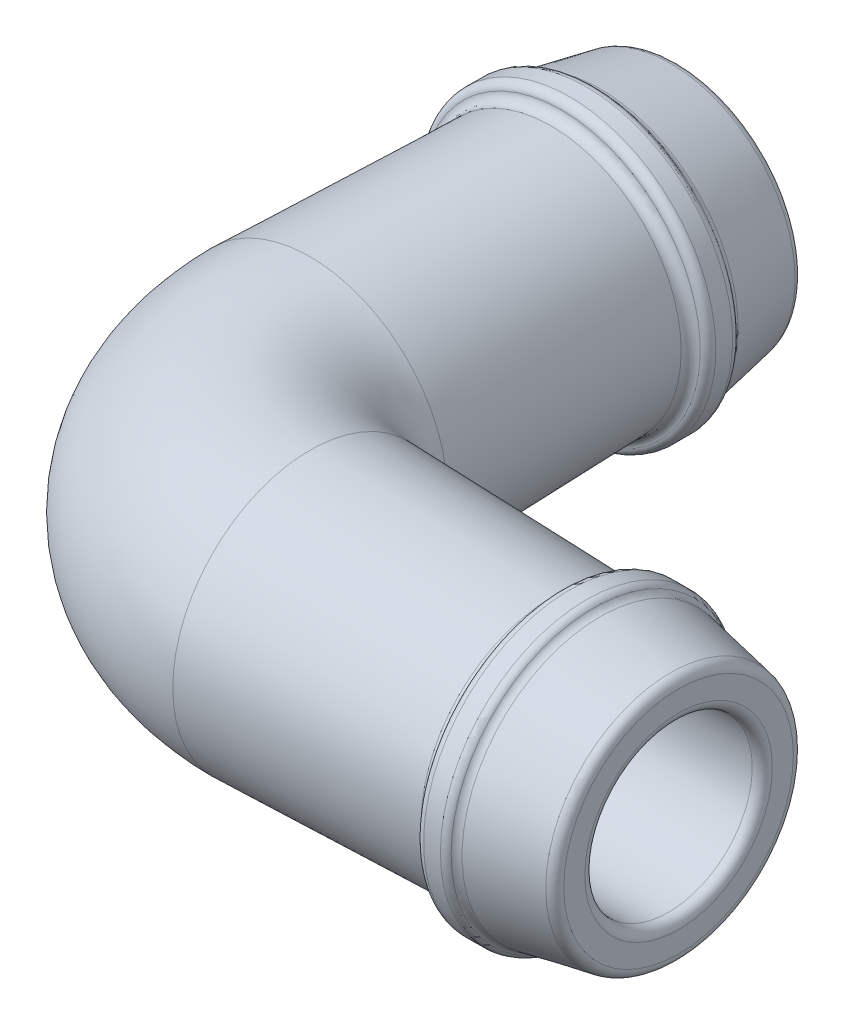
ISO-10303-21;
HEADER;
FILE_DESCRIPTION(('STEP AP214'),'2;1');
FILE_NAME('part.step','',(''),(''),'','','');
FILE_SCHEMA(('AUTOMOTIVE_DESIGN { 1 0 10303 214 1 1 1 1 }'));
ENDSEC;
DATA;
#1=APPLICATION_CONTEXT('core data for automotive mechanical design processes');
#2=APPLICATION_PROTOCOL_DEFINITION('international standard','automotive_design',2000,#1);
#3=PRODUCT_CONTEXT('',#1,'mechanical');
#4=PRODUCT('Part','Part','',(#3));
#5=PRODUCT_RELATED_PRODUCT_CATEGORY('part','',(#4));
#6=PRODUCT_DEFINITION_FORMATION('','',#4);
#7=PRODUCT_DEFINITION_CONTEXT('part definition',#1,'design');
#8=PRODUCT_DEFINITION('design','',#6,#7);
#9=PRODUCT_DEFINITION_SHAPE('','',#8);
#10=(LENGTH_UNIT() NAMED_UNIT(*) SI_UNIT(.MILLI.,.METRE.));
#11=(NAMED_UNIT(*) PLANE_ANGLE_UNIT() SI_UNIT($,.RADIAN.));
#12=(NAMED_UNIT(*) SI_UNIT($,.STERADIAN.) SOLID_ANGLE_UNIT());
#13=UNCERTAINTY_MEASURE_WITH_UNIT(LENGTH_MEASURE(1.E-05),#10,'distance_accuracy_value','');
#14=(GEOMETRIC_REPRESENTATION_CONTEXT(3) GLOBAL_UNCERTAINTY_ASSIGNED_CONTEXT((#13)) GLOBAL_UNIT_ASSIGNED_CONTEXT((#10,
#11,#12)) REPRESENTATION_CONTEXT('',''));
#15=CARTESIAN_POINT('',(0.,0.,0.));
#16=DIRECTION('',(0.,0.,1.));
#17=DIRECTION('',(1.,0.,0.));
#18=AXIS2_PLACEMENT_3D('',#15,#16,#17);
#19=CARTESIAN_POINT('',(10.,0.,0.));
#20=DIRECTION('',(0.,1.,0.));
#21=DIRECTION('',(0.,0.,1.));
#22=AXIS2_PLACEMENT_3D('',#19,#20,#21);
#23=TOROIDAL_SURFACE('',#22,10.,8.2);
#24=CARTESIAN_POINT('',(0.,0.,0.));
#25=DIRECTION('',(0.,0.,1.));
#26=DIRECTION('',(0.,-1.,0.));
#27=AXIS2_PLACEMENT_3D('',#24,#25,#26);
#28=CIRCLE('',#27,8.2);
#29=CARTESIAN_POINT('',(-8.2,0.,0.));
#30=VERTEX_POINT('',#29);
#31=EDGE_CURVE('E49',#30,#30,#28,.T.);
#32=CARTESIAN_POINT('',(10.,0.,10.));
#33=DIRECTION('',(1.,0.,0.));
#34=DIRECTION('',(0.,0.,-1.));
#35=AXIS2_PLACEMENT_3D('',#32,#33,#34);
#36=CIRCLE('',#35,8.2);
#37=CARTESIAN_POINT('',(10.,0.,18.2));
#38=VERTEX_POINT('',#37);
#39=EDGE_CURVE('E10',#38,#38,#36,.T.);
#40=CARTESIAN_POINT('',(10.,0.,0.));
#41=DIRECTION('',(0.,1.,0.));
#42=DIRECTION('',(0.,0.,1.));
#43=AXIS2_PLACEMENT_3D('',#40,#41,#42);
#44=CIRCLE('',#43,18.2);
#45=EDGE_CURVE('',#30,#38,#44,.T.);
#46=ORIENTED_EDGE('',*,*,#31,.T.);
#47=ORIENTED_EDGE('',*,*,#39,.F.);
#48=ORIENTED_EDGE('',*,*,#45,.T.);
#49=ORIENTED_EDGE('',*,*,#45,.F.);
#50=EDGE_LOOP('',(#46,#48,#47,#49));
#51=FACE_BOUND('',#50,.T.);
#52=ADVANCED_FACE('F32',(#51),#23,.T.);
#53=CARTESIAN_POINT('',(10.,0.,0.));
#54=DIRECTION('',(0.,1.,0.));
#55=DIRECTION('',(0.,0.,1.));
#56=AXIS2_PLACEMENT_3D('',#53,#54,#55);
#57=TOROIDAL_SURFACE('',#56,10.,5.);
#58=CARTESIAN_POINT('',(0.,0.,0.));
#59=DIRECTION('',(0.,0.,1.));
#60=DIRECTION('',(0.,-1.,0.));
#61=AXIS2_PLACEMENT_3D('',#58,#59,#60);
#62=CIRCLE('',#61,5.);
#63=CARTESIAN_POINT('',(-5.,0.,0.));
#64=VERTEX_POINT('',#63);
#65=EDGE_CURVE('E51',#64,#64,#62,.T.);
#66=CARTESIAN_POINT('',(10.,0.,10.));
#67=DIRECTION('',(-1.,0.,0.));
#68=DIRECTION('',(0.,0.,1.));
#69=AXIS2_PLACEMENT_3D('',#66,#67,#68);
#70=CIRCLE('',#69,5.);
#71=CARTESIAN_POINT('',(10.,0.,15.));
#72=VERTEX_POINT('',#71);
#73=EDGE_CURVE('E38',#72,#72,#70,.T.);
#74=CARTESIAN_POINT('',(10.,0.,0.));
#75=DIRECTION('',(0.,1.,0.));
#76=DIRECTION('',(0.,0.,1.));
#77=AXIS2_PLACEMENT_3D('',#74,#75,#76);
#78=CIRCLE('',#77,15.);
#79=EDGE_CURVE('',#64,#72,#78,.T.);
#80=ORIENTED_EDGE('',*,*,#65,.F.);
#81=ORIENTED_EDGE('',*,*,#73,.F.);
#82=ORIENTED_EDGE('',*,*,#79,.T.);
#83=ORIENTED_EDGE('',*,*,#79,.F.);
#84=EDGE_LOOP('',(#80,#82,#81,#83));
#85=FACE_BOUND('',#84,.T.);
#86=ADVANCED_FACE('F131',(#85),#57,.F.);
#87=CARTESIAN_POINT('',(7.35,0.,-22.));
#88=DIRECTION('',(0.,0.,-1.));
#89=DIRECTION('',(0.,1.,0.));
#90=AXIS2_PLACEMENT_3D('',#87,#88,#89);
#91=PLANE('',#90);
#92=CARTESIAN_POINT('',(0.,0.,-22.));
#93=DIRECTION('',(0.,0.,-1.));
#94=DIRECTION('',(0.,1.,0.));
#95=AXIS2_PLACEMENT_3D('',#92,#93,#94);
#96=CIRCLE('',#95,5.6);
#97=CARTESIAN_POINT('',(0.,5.6,-22.));
#98=VERTEX_POINT('',#97);
#99=EDGE_CURVE('E68',#98,#98,#96,.F.);
#100=ORIENTED_EDGE('',*,*,#99,.T.);
#101=EDGE_LOOP('',(#100));
#102=FACE_BOUND('',#101,.T.);
#103=CARTESIAN_POINT('',(0.,0.,-22.));
#104=DIRECTION('',(0.,0.,-1.));
#105=DIRECTION('',(0.,1.,0.));
#106=AXIS2_PLACEMENT_3D('',#103,#104,#105);
#107=CIRCLE('',#106,6.85326601535529);
#108=CARTESIAN_POINT('',(0.,6.85326601535529,-22.));
#109=VERTEX_POINT('',#108);
#110=EDGE_CURVE('E71',#109,#109,#107,.T.);
#111=ORIENTED_EDGE('',*,*,#110,.T.);
#112=EDGE_LOOP('',(#111));
#113=FACE_BOUND('',#112,.T.);
#114=ADVANCED_FACE('F136',(#102,#113),#91,.T.);
#115=CARTESIAN_POINT('',(0.,0.,0.));
#116=DIRECTION('',(0.,0.,1.));
#117=DIRECTION('',(0.,-1.,0.));
#118=AXIS2_PLACEMENT_3D('',#115,#116,#117);
#119=CYLINDRICAL_SURFACE('',#118,5.);
#120=CARTESIAN_POINT('',(0.,0.,-21.4));
#121=DIRECTION('',(0.,0.,-1.));
#122=DIRECTION('',(0.,1.,0.));
#123=AXIS2_PLACEMENT_3D('',#120,#121,#122);
#124=CIRCLE('',#123,5.);
#125=CARTESIAN_POINT('',(0.,5.,-21.4));
#126=VERTEX_POINT('',#125);
#127=EDGE_CURVE('E65',#126,#126,#124,.T.);
#128=ORIENTED_EDGE('',*,*,#127,.T.);
#129=EDGE_LOOP('',(#128));
#130=FACE_BOUND('',#129,.T.);
#131=ORIENTED_EDGE('',*,*,#65,.T.);
#132=EDGE_LOOP('',(#131));
#133=FACE_BOUND('',#132,.T.);
#134=ADVANCED_FACE('F144',(#130,#133),#119,.F.);
#135=CARTESIAN_POINT('',(0.,0.,0.));
#136=DIRECTION('',(0.,0.,1.));
#137=DIRECTION('',(0.,-1.,0.));
#138=AXIS2_PLACEMENT_3D('',#135,#136,#137);
#139=CONICAL_SURFACE('',#138,8.2,0.0299910048568778);
#140=CARTESIAN_POINT('',(0.,0.,-14.39134138244));
#141=DIRECTION('',(0.,0.,1.));
#142=DIRECTION('',(0.,-1.,0.));
#143=AXIS2_PLACEMENT_3D('',#140,#141,#142);
#144=CIRCLE('',#143,7.7682597585268);
#145=CARTESIAN_POINT('',(0.,-7.7682597585268,-14.39134138244));
#146=VERTEX_POINT('',#145);
#147=EDGE_CURVE('E56',#146,#146,#144,.T.);
#148=ORIENTED_EDGE('',*,*,#147,.T.);
#149=EDGE_LOOP('',(#148));
#150=FACE_BOUND('',#149,.T.);
#151=ORIENTED_EDGE('',*,*,#31,.F.);
#152=EDGE_LOOP('',(#151));
#153=FACE_BOUND('',#152,.T.);
#154=ADVANCED_FACE('F141',(#150,#153),#139,.T.);
#155=CARTESIAN_POINT('',(0.,0.,0.));
#156=DIRECTION('',(0.,0.,1.));
#157=DIRECTION('',(0.,-1.,0.));
#158=AXIS2_PLACEMENT_3D('',#155,#156,#157);
#159=CYLINDRICAL_SURFACE('',#158,8.725);
#160=CARTESIAN_POINT('',(0.,0.,-15.5));
#161=DIRECTION('',(0.,0.,1.));
#162=DIRECTION('',(0.,-1.,0.));
#163=AXIS2_PLACEMENT_3D('',#160,#161,#162);
#164=CIRCLE('',#163,8.725);
#165=CARTESIAN_POINT('',(0.,-8.725,-15.5));
#166=VERTEX_POINT('',#165);
#167=EDGE_CURVE('E74',#166,#166,#164,.F.);
#168=ORIENTED_EDGE('',*,*,#167,.T.);
#169=EDGE_LOOP('',(#168));
#170=FACE_BOUND('',#169,.T.);
#171=CARTESIAN_POINT('',(0.,0.,-16.5056570016679));
#172=DIRECTION('',(0.,0.,-1.));
#173=DIRECTION('',(0.,1.,0.));
#174=AXIS2_PLACEMENT_3D('',#171,#172,#173);
#175=CIRCLE('',#174,8.725);
#176=CARTESIAN_POINT('',(0.,8.725,-16.5056570016679));
#177=VERTEX_POINT('',#176);
#178=EDGE_CURVE('E77',#177,#177,#175,.F.);
#179=ORIENTED_EDGE('',*,*,#178,.T.);
#180=EDGE_LOOP('',(#179));
#181=FACE_BOUND('',#180,.T.);
#182=ADVANCED_FACE('F143',(#170,#181),#159,.T.);
#183=CARTESIAN_POINT('',(0.,0.,-17.));
#184=DIRECTION('',(0.,0.,1.));
#185=DIRECTION('',(0.,-1.,0.));
#186=AXIS2_PLACEMENT_3D('',#183,#184,#185);
#187=CONICAL_SURFACE('',#186,8.3,0.187761946513593);
#188=CARTESIAN_POINT('',(0.,0.,-21.511996387494));
#189=DIRECTION('',(0.,0.,-1.));
#190=DIRECTION('',(0.,1.,0.));
#191=AXIS2_PLACEMENT_3D('',#188,#189,#190);
#192=CIRCLE('',#191,7.44272068637615);
#193=CARTESIAN_POINT('',(0.,7.44272068637615,-21.511996387494));
#194=VERTEX_POINT('',#193);
#195=EDGE_CURVE('E59',#194,#194,#192,.F.);
#196=ORIENTED_EDGE('',*,*,#195,.T.);
#197=EDGE_LOOP('',(#196));
#198=FACE_BOUND('',#197,.T.);
#199=CARTESIAN_POINT('',(0.,0.,-17.3122591132258));
#200=DIRECTION('',(0.,0.,1.));
#201=DIRECTION('',(0.,-1.,0.));
#202=AXIS2_PLACEMENT_3D('',#199,#200,#201);
#203=CIRCLE('',#202,8.24067076848711);
#204=CARTESIAN_POINT('',(0.,-8.24067076848711,-17.3122591132258));
#205=VERTEX_POINT('',#204);
#206=EDGE_CURVE('E62',#205,#205,#203,.F.);
#207=ORIENTED_EDGE('',*,*,#206,.T.);
#208=EDGE_LOOP('',(#207));
#209=FACE_BOUND('',#208,.T.);
#210=ADVANCED_FACE('F151',(#198,#209),#187,.T.);
#211=CARTESIAN_POINT('',(0.,0.,-15.5));
#212=DIRECTION('',(0.,0.,1.));
#213=DIRECTION('',(0.,-1.,0.));
#214=AXIS2_PLACEMENT_3D('',#211,#212,#213);
#215=TOROIDAL_SURFACE('',#214,8.225,0.5);
#216=CARTESIAN_POINT('',(0.,0.,-15.0042424035935));
#217=DIRECTION('',(0.,0.,-1.));
#218=DIRECTION('',(0.,1.,0.));
#219=AXIS2_PLACEMENT_3D('',#216,#217,#218);
#220=CIRCLE('',#219,8.28999542756359);
#221=CARTESIAN_POINT('',(0.,8.28999542756359,-15.0042424035935));
#222=VERTEX_POINT('',#221);
#223=EDGE_CURVE('E46',#222,#222,#220,.T.);
#224=ORIENTED_EDGE('',*,*,#223,.T.);
#225=EDGE_LOOP('',(#224));
#226=FACE_BOUND('',#225,.T.);
#227=ORIENTED_EDGE('',*,*,#167,.F.);
#228=EDGE_LOOP('',(#227));
#229=FACE_BOUND('',#228,.T.);
#230=ADVANCED_FACE('F161',(#226,#229),#215,.T.);
#231=CARTESIAN_POINT('',(0.,0.,-16.5056570016679));
#232=DIRECTION('',(0.,0.,-1.));
#233=DIRECTION('',(0.,1.,0.));
#234=AXIS2_PLACEMENT_3D('',#231,#232,#233);
#235=TOROIDAL_SURFACE('',#234,8.225,0.5);
#236=CARTESIAN_POINT('',(0.,0.,-16.9232017739642));
#237=DIRECTION('',(0.,0.,1.));
#238=DIRECTION('',(0.,-1.,0.));
#239=AXIS2_PLACEMENT_3D('',#236,#237,#238);
#240=CIRCLE('',#239,8.50005701795821);
#241=CARTESIAN_POINT('',(0.,-8.50005701795821,-16.9232017739642));
#242=VERTEX_POINT('',#241);
#243=EDGE_CURVE('E42',#242,#242,#240,.T.);
#244=ORIENTED_EDGE('',*,*,#243,.T.);
#245=EDGE_LOOP('',(#244));
#246=FACE_BOUND('',#245,.T.);
#247=ORIENTED_EDGE('',*,*,#178,.F.);
#248=EDGE_LOOP('',(#247));
#249=FACE_BOUND('',#248,.T.);
#250=ADVANCED_FACE('F164',(#246,#249),#235,.T.);
#251=CARTESIAN_POINT('',(0.,0.,-21.4));
#252=DIRECTION('',(0.,0.,-1.));
#253=DIRECTION('',(0.,1.,0.));
#254=AXIS2_PLACEMENT_3D('',#251,#252,#253);
#255=TOROIDAL_SURFACE('',#254,5.6,0.6);
#256=ORIENTED_EDGE('',*,*,#127,.F.);
#257=EDGE_LOOP('',(#256));
#258=FACE_BOUND('',#257,.T.);
#259=ORIENTED_EDGE('',*,*,#99,.F.);
#260=EDGE_LOOP('',(#259));
#261=FACE_BOUND('',#260,.T.);
#262=ADVANCED_FACE('F168',(#258,#261),#255,.T.);
#263=CARTESIAN_POINT('',(0.,0.,-21.4));
#264=DIRECTION('',(0.,0.,-1.));
#265=DIRECTION('',(0.,1.,0.));
#266=AXIS2_PLACEMENT_3D('',#263,#264,#265);
#267=TOROIDAL_SURFACE('',#266,6.85326601535529,0.6);
#268=ORIENTED_EDGE('',*,*,#110,.F.);
#269=EDGE_LOOP('',(#268));
#270=FACE_BOUND('',#269,.T.);
#271=ORIENTED_EDGE('',*,*,#195,.F.);
#272=EDGE_LOOP('',(#271));
#273=FACE_BOUND('',#272,.T.);
#274=ADVANCED_FACE('F172',(#270,#273),#267,.T.);
#275=CARTESIAN_POINT('',(0.,0.,-14.4093332879034));
#276=DIRECTION('',(0.,0.,1.));
#277=DIRECTION('',(0.,-1.,0.));
#278=AXIS2_PLACEMENT_3D('',#275,#276,#277);
#279=TOROIDAL_SURFACE('',#278,8.36798994064022,0.6);
#280=ORIENTED_EDGE('',*,*,#223,.F.);
#281=EDGE_LOOP('',(#280));
#282=FACE_BOUND('',#281,.T.);
#283=ORIENTED_EDGE('',*,*,#147,.F.);
#284=EDGE_LOOP('',(#283));
#285=FACE_BOUND('',#284,.T.);
#286=ADVANCED_FACE('F176',(#282,#285),#279,.F.);
#287=CARTESIAN_POINT('',(0.,0.,-17.4242555007197));
#288=DIRECTION('',(0.,0.,1.));
#289=DIRECTION('',(0.,-1.,0.));
#290=AXIS2_PLACEMENT_3D('',#287,#288,#289);
#291=TOROIDAL_SURFACE('',#290,8.83012543950796,0.6);
#292=ORIENTED_EDGE('',*,*,#206,.F.);
#293=EDGE_LOOP('',(#292));
#294=FACE_BOUND('',#293,.T.);
#295=ORIENTED_EDGE('',*,*,#243,.F.);
#296=EDGE_LOOP('',(#295));
#297=FACE_BOUND('',#296,.T.);
#298=ADVANCED_FACE('F180',(#294,#297),#291,.F.);
#299=CARTESIAN_POINT('',(32.,-7.35,9.99999999999999));
#300=DIRECTION('',(1.,0.,0.));
#301=DIRECTION('',(0.,0.,1.));
#302=AXIS2_PLACEMENT_3D('',#299,#300,#301);
#303=PLANE('',#302);
#304=CARTESIAN_POINT('',(32.,0.,9.99999999999999));
#305=DIRECTION('',(1.,0.,0.));
#306=DIRECTION('',(0.,0.,1.));
#307=AXIS2_PLACEMENT_3D('',#304,#305,#306);
#308=CIRCLE('',#307,5.6);
#309=CARTESIAN_POINT('',(32.,0.,15.6));
#310=VERTEX_POINT('',#309);
#311=EDGE_CURVE('E99',#310,#310,#308,.F.);
#312=ORIENTED_EDGE('',*,*,#311,.T.);
#313=EDGE_LOOP('',(#312));
#314=FACE_BOUND('',#313,.T.);
#315=CARTESIAN_POINT('',(32.,0.,9.99999999999999));
#316=DIRECTION('',(1.,0.,0.));
#317=DIRECTION('',(0.,0.,1.));
#318=AXIS2_PLACEMENT_3D('',#315,#316,#317);
#319=CIRCLE('',#318,6.85326601535529);
#320=CARTESIAN_POINT('',(32.,0.,16.8532660153553));
#321=VERTEX_POINT('',#320);
#322=EDGE_CURVE('E102',#321,#321,#319,.T.);
#323=ORIENTED_EDGE('',*,*,#322,.T.);
#324=EDGE_LOOP('',(#323));
#325=FACE_BOUND('',#324,.T.);
#326=ADVANCED_FACE('F183',(#314,#325),#303,.T.);
#327=CARTESIAN_POINT('',(10.,0.,10.));
#328=DIRECTION('',(-1.,0.,0.));
#329=DIRECTION('',(0.,0.,-1.));
#330=AXIS2_PLACEMENT_3D('',#327,#328,#329);
#331=CYLINDRICAL_SURFACE('',#330,5.);
#332=CARTESIAN_POINT('',(31.4,0.,9.99999999999999));
#333=DIRECTION('',(1.,0.,0.));
#334=DIRECTION('',(0.,0.,1.));
#335=AXIS2_PLACEMENT_3D('',#332,#333,#334);
#336=CIRCLE('',#335,5.);
#337=CARTESIAN_POINT('',(31.4,0.,15.));
#338=VERTEX_POINT('',#337);
#339=EDGE_CURVE('E96',#338,#338,#336,.T.);
#340=ORIENTED_EDGE('',*,*,#339,.T.);
#341=EDGE_LOOP('',(#340));
#342=FACE_BOUND('',#341,.T.);
#343=ORIENTED_EDGE('',*,*,#73,.T.);
#344=EDGE_LOOP('',(#343));
#345=FACE_BOUND('',#344,.T.);
#346=ADVANCED_FACE('F188',(#342,#345),#331,.F.);
#347=CARTESIAN_POINT('',(10.,0.,10.));
#348=DIRECTION('',(-1.,0.,0.));
#349=DIRECTION('',(0.,0.,-1.));
#350=AXIS2_PLACEMENT_3D('',#347,#348,#349);
#351=CONICAL_SURFACE('',#350,8.2,0.0299910048568778);
#352=CARTESIAN_POINT('',(24.39134138244,0.,9.99999999999999));
#353=DIRECTION('',(-1.,0.,0.));
#354=DIRECTION('',(0.,0.,-1.));
#355=AXIS2_PLACEMENT_3D('',#352,#353,#354);
#356=CIRCLE('',#355,7.7682597585268);
#357=CARTESIAN_POINT('',(24.39134138244,0.,2.23174024147319));
#358=VERTEX_POINT('',#357);
#359=EDGE_CURVE('E87',#358,#358,#356,.T.);
#360=ORIENTED_EDGE('',*,*,#359,.T.);
#361=EDGE_LOOP('',(#360));
#362=FACE_BOUND('',#361,.T.);
#363=ORIENTED_EDGE('',*,*,#39,.T.);
#364=EDGE_LOOP('',(#363));
#365=FACE_BOUND('',#364,.T.);
#366=ADVANCED_FACE('F228',(#362,#365),#351,.T.);
#367=CARTESIAN_POINT('',(10.,0.,10.));
#368=DIRECTION('',(-1.,0.,0.));
#369=DIRECTION('',(0.,0.,-1.));
#370=AXIS2_PLACEMENT_3D('',#367,#368,#369);
#371=CYLINDRICAL_SURFACE('',#370,8.725);
#372=CARTESIAN_POINT('',(25.5,0.,9.99999999999999));
#373=DIRECTION('',(-1.,0.,0.));
#374=DIRECTION('',(0.,0.,-1.));
#375=AXIS2_PLACEMENT_3D('',#372,#373,#374);
#376=CIRCLE('',#375,8.725);
#377=CARTESIAN_POINT('',(25.5,0.,1.27499999999999));
#378=VERTEX_POINT('',#377);
#379=EDGE_CURVE('E105',#378,#378,#376,.F.);
#380=ORIENTED_EDGE('',*,*,#379,.T.);
#381=EDGE_LOOP('',(#380));
#382=FACE_BOUND('',#381,.T.);
#383=CARTESIAN_POINT('',(26.5056570016679,0.,9.99999999999999));
#384=DIRECTION('',(1.,0.,0.));
#385=DIRECTION('',(0.,0.,1.));
#386=AXIS2_PLACEMENT_3D('',#383,#384,#385);
#387=CIRCLE('',#386,8.725);
#388=CARTESIAN_POINT('',(26.5056570016679,0.,18.725));
#389=VERTEX_POINT('',#388);
#390=EDGE_CURVE('E108',#389,#389,#387,.F.);
#391=ORIENTED_EDGE('',*,*,#390,.T.);
#392=EDGE_LOOP('',(#391));
#393=FACE_BOUND('',#392,.T.);
#394=ADVANCED_FACE('F112',(#382,#393),#371,.T.);
#395=CARTESIAN_POINT('',(27.,0.,9.99999999999999));
#396=DIRECTION('',(-1.,0.,0.));
#397=DIRECTION('',(0.,0.,-1.));
#398=AXIS2_PLACEMENT_3D('',#395,#396,#397);
#399=CONICAL_SURFACE('',#398,8.3,0.187761946513593);
#400=CARTESIAN_POINT('',(31.511996387494,0.,9.99999999999999));
#401=DIRECTION('',(1.,0.,0.));
#402=DIRECTION('',(0.,0.,1.));
#403=AXIS2_PLACEMENT_3D('',#400,#401,#402);
#404=CIRCLE('',#403,7.44272068637615);
#405=CARTESIAN_POINT('',(31.511996387494,0.,17.4427206863761));
#406=VERTEX_POINT('',#405);
#407=EDGE_CURVE('E90',#406,#406,#404,.F.);
#408=ORIENTED_EDGE('',*,*,#407,.T.);
#409=EDGE_LOOP('',(#408));
#410=FACE_BOUND('',#409,.T.);
#411=CARTESIAN_POINT('',(27.3122591132258,0.,9.99999999999999));
#412=DIRECTION('',(-1.,0.,0.));
#413=DIRECTION('',(0.,0.,-1.));
#414=AXIS2_PLACEMENT_3D('',#411,#412,#413);
#415=CIRCLE('',#414,8.24067076848711);
#416=CARTESIAN_POINT('',(27.3122591132258,0.,1.75932923151289));
#417=VERTEX_POINT('',#416);
#418=EDGE_CURVE('E93',#417,#417,#415,.F.);
#419=ORIENTED_EDGE('',*,*,#418,.T.);
#420=EDGE_LOOP('',(#419));
#421=FACE_BOUND('',#420,.T.);
#422=ADVANCED_FACE('F127',(#410,#421),#399,.T.);
#423=CARTESIAN_POINT('',(25.5,0.,9.99999999999999));
#424=DIRECTION('',(-1.,0.,0.));
#425=DIRECTION('',(0.,0.,-1.));
#426=AXIS2_PLACEMENT_3D('',#423,#424,#425);
#427=TOROIDAL_SURFACE('',#426,8.225,0.5);
#428=CARTESIAN_POINT('',(25.0042424035936,0.,9.99999999999999));
#429=DIRECTION('',(1.,0.,0.));
#430=DIRECTION('',(0.,0.,1.));
#431=AXIS2_PLACEMENT_3D('',#428,#429,#430);
#432=CIRCLE('',#431,8.28999542756359);
#433=CARTESIAN_POINT('',(25.0042424035936,0.,18.2899954275636));
#434=VERTEX_POINT('',#433);
#435=EDGE_CURVE('E84',#434,#434,#432,.T.);
#436=ORIENTED_EDGE('',*,*,#435,.T.);
#437=EDGE_LOOP('',(#436));
#438=FACE_BOUND('',#437,.T.);
#439=ORIENTED_EDGE('',*,*,#379,.F.);
#440=EDGE_LOOP('',(#439));
#441=FACE_BOUND('',#440,.T.);
#442=ADVANCED_FACE('F117',(#438,#441),#427,.T.);
#443=CARTESIAN_POINT('',(26.5056570016679,0.,9.99999999999999));
#444=DIRECTION('',(1.,0.,0.));
#445=DIRECTION('',(0.,0.,1.));
#446=AXIS2_PLACEMENT_3D('',#443,#444,#445);
#447=TOROIDAL_SURFACE('',#446,8.225,0.5);
#448=CARTESIAN_POINT('',(26.9232017739642,0.,9.99999999999999));
#449=DIRECTION('',(-1.,0.,0.));
#450=DIRECTION('',(0.,0.,-1.));
#451=AXIS2_PLACEMENT_3D('',#448,#449,#450);
#452=CIRCLE('',#451,8.50005701795821);
#453=CARTESIAN_POINT('',(26.9232017739642,0.,1.49994298204179));
#454=VERTEX_POINT('',#453);
#455=EDGE_CURVE('E52',#454,#454,#452,.T.);
#456=ORIENTED_EDGE('',*,*,#455,.T.);
#457=EDGE_LOOP('',(#456));
#458=FACE_BOUND('',#457,.T.);
#459=ORIENTED_EDGE('',*,*,#390,.F.);
#460=EDGE_LOOP('',(#459));
#461=FACE_BOUND('',#460,.T.);
#462=ADVANCED_FACE('F114',(#458,#461),#447,.T.);
#463=CARTESIAN_POINT('',(31.4,0.,9.99999999999999));
#464=DIRECTION('',(1.,0.,0.));
#465=DIRECTION('',(0.,0.,1.));
#466=AXIS2_PLACEMENT_3D('',#463,#464,#465);
#467=TOROIDAL_SURFACE('',#466,5.6,0.6);
#468=ORIENTED_EDGE('',*,*,#339,.F.);
#469=EDGE_LOOP('',(#468));
#470=FACE_BOUND('',#469,.T.);
#471=ORIENTED_EDGE('',*,*,#311,.F.);
#472=EDGE_LOOP('',(#471));
#473=FACE_BOUND('',#472,.T.);
#474=ADVANCED_FACE('F116',(#470,#473),#467,.T.);
#475=CARTESIAN_POINT('',(31.4,0.,9.99999999999999));
#476=DIRECTION('',(1.,0.,0.));
#477=DIRECTION('',(0.,0.,1.));
#478=AXIS2_PLACEMENT_3D('',#475,#476,#477);
#479=TOROIDAL_SURFACE('',#478,6.85326601535529,0.6);
#480=ORIENTED_EDGE('',*,*,#322,.F.);
#481=EDGE_LOOP('',(#480));
#482=FACE_BOUND('',#481,.T.);
#483=ORIENTED_EDGE('',*,*,#407,.F.);
#484=EDGE_LOOP('',(#483));
#485=FACE_BOUND('',#484,.T.);
#486=ADVANCED_FACE('F124',(#482,#485),#479,.T.);
#487=CARTESIAN_POINT('',(24.4093332879034,0.,9.99999999999999));
#488=DIRECTION('',(-1.,0.,0.));
#489=DIRECTION('',(0.,0.,-1.));
#490=AXIS2_PLACEMENT_3D('',#487,#488,#489);
#491=TOROIDAL_SURFACE('',#490,8.36798994064022,0.6);
#492=ORIENTED_EDGE('',*,*,#435,.F.);
#493=EDGE_LOOP('',(#492));
#494=FACE_BOUND('',#493,.T.);
#495=ORIENTED_EDGE('',*,*,#359,.F.);
#496=EDGE_LOOP('',(#495));
#497=FACE_BOUND('',#496,.T.);
#498=ADVANCED_FACE('F206',(#494,#497),#491,.F.);
#499=CARTESIAN_POINT('',(27.4242555007197,0.,9.99999999999999));
#500=DIRECTION('',(-1.,0.,0.));
#501=DIRECTION('',(0.,0.,-1.));
#502=AXIS2_PLACEMENT_3D('',#499,#500,#501);
#503=TOROIDAL_SURFACE('',#502,8.83012543950796,0.6);
#504=ORIENTED_EDGE('',*,*,#418,.F.);
#505=EDGE_LOOP('',(#504));
#506=FACE_BOUND('',#505,.T.);
#507=ORIENTED_EDGE('',*,*,#455,.F.);
#508=EDGE_LOOP('',(#507));
#509=FACE_BOUND('',#508,.T.);
#510=ADVANCED_FACE('F203',(#506,#509),#503,.F.);
#511=CLOSED_SHELL('',(#52,#86,#114,#134,#154,#182,#210,#230,#250,#262,#274,#286,#298,#326,#346,
#366,#394,#422,#442,#462,#474,#486,#498,#510));
#512=MANIFOLD_SOLID_BREP('B2',#511);
#513=ADVANCED_BREP_SHAPE_REPRESENTATION('',(#18,#512),#14);
#514=SHAPE_DEFINITION_REPRESENTATION(#9,#513);
ENDSEC;
END-ISO-10303-21;
